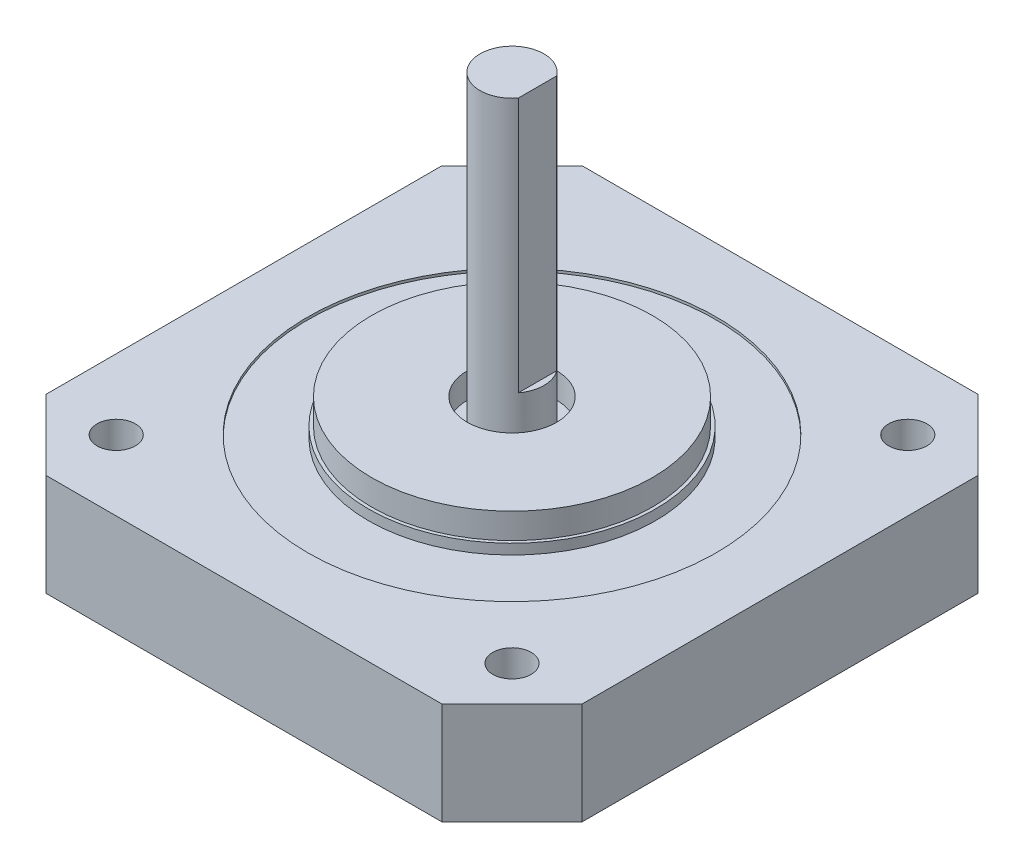
ISO-10303-21;
HEADER;
FILE_DESCRIPTION(('STEP AP214'),'2;1');
FILE_NAME('part.step','',(''),(''),'','','');
FILE_SCHEMA(('AUTOMOTIVE_DESIGN { 1 0 10303 214 1 1 1 1 }'));
ENDSEC;
DATA;
#1=APPLICATION_CONTEXT('core data for automotive mechanical design processes');
#2=APPLICATION_PROTOCOL_DEFINITION('international standard','automotive_design',2000,#1);
#3=PRODUCT_CONTEXT('',#1,'mechanical');
#4=PRODUCT('Part','Part','',(#3));
#5=PRODUCT_RELATED_PRODUCT_CATEGORY('part','',(#4));
#6=PRODUCT_DEFINITION_FORMATION('','',#4);
#7=PRODUCT_DEFINITION_CONTEXT('part definition',#1,'design');
#8=PRODUCT_DEFINITION('design','',#6,#7);
#9=PRODUCT_DEFINITION_SHAPE('','',#8);
#10=(LENGTH_UNIT() NAMED_UNIT(*) SI_UNIT(.MILLI.,.METRE.));
#11=(NAMED_UNIT(*) PLANE_ANGLE_UNIT() SI_UNIT($,.RADIAN.));
#12=(NAMED_UNIT(*) SI_UNIT($,.STERADIAN.) SOLID_ANGLE_UNIT());
#13=UNCERTAINTY_MEASURE_WITH_UNIT(LENGTH_MEASURE(1.E-05),#10,'distance_accuracy_value','');
#14=(GEOMETRIC_REPRESENTATION_CONTEXT(3) GLOBAL_UNCERTAINTY_ASSIGNED_CONTEXT((#13)) GLOBAL_UNIT_ASSIGNED_CONTEXT((#10,
#11,#12)) REPRESENTATION_CONTEXT('',''));
#15=CARTESIAN_POINT('',(0.,0.,0.));
#16=DIRECTION('',(0.,0.,1.));
#17=DIRECTION('',(1.,0.,0.));
#18=AXIS2_PLACEMENT_3D('',#15,#16,#17);
#19=CARTESIAN_POINT('',(21.,8.,-21.));
#20=DIRECTION('',(-1.,0.,0.));
#21=DIRECTION('',(0.,0.,1.));
#22=AXIS2_PLACEMENT_3D('',#19,#20,#21);
#23=PLANE('',#22);
#24=DIRECTION('',(0.,0.,-1.));
#25=VECTOR('',#24,1.);
#26=CARTESIAN_POINT('',(21.,0.,-21.));
#27=LINE('',#26,#25);
#28=CARTESIAN_POINT('',(21.,0.,15.5));
#29=VERTEX_POINT('',#28);
#30=CARTESIAN_POINT('',(21.,0.,-15.5));
#31=VERTEX_POINT('',#30);
#32=EDGE_CURVE('E179',#29,#31,#27,.T.);
#33=ORIENTED_EDGE('',*,*,#32,.T.);
#34=DIRECTION('',(0.,1.,0.));
#35=VECTOR('',#34,1.);
#36=CARTESIAN_POINT('',(21.,8.,-15.5));
#37=LINE('',#36,#35);
#38=CARTESIAN_POINT('',(21.,8.,-15.5));
#39=VERTEX_POINT('',#38);
#40=EDGE_CURVE('E232',#31,#39,#37,.T.);
#41=ORIENTED_EDGE('',*,*,#40,.T.);
#42=DIRECTION('',(0.,0.,-1.));
#43=VECTOR('',#42,1.);
#44=CARTESIAN_POINT('',(21.,8.,-21.));
#45=LINE('',#44,#43);
#46=CARTESIAN_POINT('',(21.,8.,15.5));
#47=VERTEX_POINT('',#46);
#48=EDGE_CURVE('E182',#47,#39,#45,.T.);
#49=ORIENTED_EDGE('',*,*,#48,.F.);
#50=DIRECTION('',(0.,-1.,0.));
#51=VECTOR('',#50,1.);
#52=CARTESIAN_POINT('',(21.,8.,15.5));
#53=LINE('',#52,#51);
#54=EDGE_CURVE('E229',#47,#29,#53,.T.);
#55=ORIENTED_EDGE('',*,*,#54,.T.);
#56=EDGE_LOOP('',(#33,#41,#49,#55));
#57=FACE_BOUND('',#56,.T.);
#58=ADVANCED_FACE('F33',(#57),#23,.F.);
#59=CARTESIAN_POINT('',(-21.,8.,-21.));
#60=DIRECTION('',(0.,0.,1.));
#61=DIRECTION('',(1.,0.,0.));
#62=AXIS2_PLACEMENT_3D('',#59,#60,#61);
#63=PLANE('',#62);
#64=DIRECTION('',(-1.,0.,0.));
#65=VECTOR('',#64,1.);
#66=CARTESIAN_POINT('',(-21.,0.,-21.));
#67=LINE('',#66,#65);
#68=CARTESIAN_POINT('',(15.5,0.,-21.));
#69=VERTEX_POINT('',#68);
#70=CARTESIAN_POINT('',(-15.5,0.,-21.));
#71=VERTEX_POINT('',#70);
#72=EDGE_CURVE('E197',#69,#71,#67,.T.);
#73=ORIENTED_EDGE('',*,*,#72,.T.);
#74=DIRECTION('',(0.,1.,0.));
#75=VECTOR('',#74,1.);
#76=CARTESIAN_POINT('',(-15.5,8.,-21.));
#77=LINE('',#76,#75);
#78=CARTESIAN_POINT('',(-15.5,8.,-21.));
#79=VERTEX_POINT('',#78);
#80=EDGE_CURVE('E219',#71,#79,#77,.T.);
#81=ORIENTED_EDGE('',*,*,#80,.T.);
#82=DIRECTION('',(-1.,0.,0.));
#83=VECTOR('',#82,1.);
#84=CARTESIAN_POINT('',(-21.,8.,-21.));
#85=LINE('',#84,#83);
#86=CARTESIAN_POINT('',(15.5,8.,-21.));
#87=VERTEX_POINT('',#86);
#88=EDGE_CURVE('E185',#87,#79,#85,.T.);
#89=ORIENTED_EDGE('',*,*,#88,.F.);
#90=DIRECTION('',(0.,-1.,0.));
#91=VECTOR('',#90,1.);
#92=CARTESIAN_POINT('',(15.5,8.,-21.));
#93=LINE('',#92,#91);
#94=EDGE_CURVE('E216',#87,#69,#93,.T.);
#95=ORIENTED_EDGE('',*,*,#94,.T.);
#96=EDGE_LOOP('',(#73,#81,#89,#95));
#97=FACE_BOUND('',#96,.T.);
#98=ADVANCED_FACE('F260',(#97),#63,.F.);
#99=CARTESIAN_POINT('',(-21.,8.,-21.));
#100=DIRECTION('',(1.,0.,0.));
#101=DIRECTION('',(0.,0.,-1.));
#102=AXIS2_PLACEMENT_3D('',#99,#100,#101);
#103=PLANE('',#102);
#104=DIRECTION('',(0.,0.,1.));
#105=VECTOR('',#104,1.);
#106=CARTESIAN_POINT('',(-21.,8.,-21.));
#107=LINE('',#106,#105);
#108=CARTESIAN_POINT('',(-21.,8.,-15.5));
#109=VERTEX_POINT('',#108);
#110=CARTESIAN_POINT('',(-21.,8.,15.5));
#111=VERTEX_POINT('',#110);
#112=EDGE_CURVE('E189',#109,#111,#107,.T.);
#113=ORIENTED_EDGE('',*,*,#112,.F.);
#114=DIRECTION('',(0.,-1.,0.));
#115=VECTOR('',#114,1.);
#116=CARTESIAN_POINT('',(-21.,8.,-15.5));
#117=LINE('',#116,#115);
#118=CARTESIAN_POINT('',(-21.,0.,-15.5));
#119=VERTEX_POINT('',#118);
#120=EDGE_CURVE('E205',#109,#119,#117,.T.);
#121=ORIENTED_EDGE('',*,*,#120,.T.);
#122=DIRECTION('',(0.,0.,1.));
#123=VECTOR('',#122,1.);
#124=CARTESIAN_POINT('',(-21.,0.,-21.));
#125=LINE('',#124,#123);
#126=CARTESIAN_POINT('',(-21.,0.,15.5));
#127=VERTEX_POINT('',#126);
#128=EDGE_CURVE('E200',#119,#127,#125,.T.);
#129=ORIENTED_EDGE('',*,*,#128,.T.);
#130=DIRECTION('',(0.,1.,0.));
#131=VECTOR('',#130,1.);
#132=CARTESIAN_POINT('',(-21.,8.,15.5));
#133=LINE('',#132,#131);
#134=EDGE_CURVE('E194',#127,#111,#133,.T.);
#135=ORIENTED_EDGE('',*,*,#134,.T.);
#136=EDGE_LOOP('',(#113,#121,#129,#135));
#137=FACE_BOUND('',#136,.T.);
#138=ADVANCED_FACE('F268',(#137),#103,.F.);
#139=CARTESIAN_POINT('',(-21.,8.,21.));
#140=DIRECTION('',(0.,0.,-1.));
#141=DIRECTION('',(-1.,0.,0.));
#142=AXIS2_PLACEMENT_3D('',#139,#140,#141);
#143=PLANE('',#142);
#144=DIRECTION('',(1.,0.,0.));
#145=VECTOR('',#144,1.);
#146=CARTESIAN_POINT('',(-21.,0.,21.));
#147=LINE('',#146,#145);
#148=CARTESIAN_POINT('',(-15.5,0.,21.));
#149=VERTEX_POINT('',#148);
#150=CARTESIAN_POINT('',(15.5,0.,21.));
#151=VERTEX_POINT('',#150);
#152=EDGE_CURVE('E186',#149,#151,#147,.T.);
#153=ORIENTED_EDGE('',*,*,#152,.T.);
#154=DIRECTION('',(0.,1.,0.));
#155=VECTOR('',#154,1.);
#156=CARTESIAN_POINT('',(15.5,8.,21.));
#157=LINE('',#156,#155);
#158=CARTESIAN_POINT('',(15.5,8.,21.));
#159=VERTEX_POINT('',#158);
#160=EDGE_CURVE('E37',#151,#159,#157,.T.);
#161=ORIENTED_EDGE('',*,*,#160,.T.);
#162=DIRECTION('',(1.,0.,0.));
#163=VECTOR('',#162,1.);
#164=CARTESIAN_POINT('',(-21.,8.,21.));
#165=LINE('',#164,#163);
#166=CARTESIAN_POINT('',(-15.5,8.,21.));
#167=VERTEX_POINT('',#166);
#168=EDGE_CURVE('E192',#167,#159,#165,.T.);
#169=ORIENTED_EDGE('',*,*,#168,.F.);
#170=DIRECTION('',(0.,-1.,0.));
#171=VECTOR('',#170,1.);
#172=CARTESIAN_POINT('',(-15.5,8.,21.));
#173=LINE('',#172,#171);
#174=EDGE_CURVE('E233',#167,#149,#173,.T.);
#175=ORIENTED_EDGE('',*,*,#174,.T.);
#176=EDGE_LOOP('',(#153,#161,#169,#175));
#177=FACE_BOUND('',#176,.T.);
#178=ADVANCED_FACE('F237',(#177),#143,.F.);
#179=CARTESIAN_POINT('',(0.,8.,0.));
#180=DIRECTION('',(0.,1.,0.));
#181=DIRECTION('',(0.,0.,1.));
#182=AXIS2_PLACEMENT_3D('',#179,#180,#181);
#183=PLANE('',#182);
#184=CARTESIAN_POINT('',(0.,8.,0.));
#185=DIRECTION('',(0.,1.,0.));
#186=DIRECTION('',(0.,0.,1.));
#187=AXIS2_PLACEMENT_3D('',#184,#185,#186);
#188=CIRCLE('',#187,16.);
#189=CARTESIAN_POINT('',(0.,8.,16.));
#190=VERTEX_POINT('',#189);
#191=EDGE_CURVE('E149',#190,#190,#188,.T.);
#192=ORIENTED_EDGE('',*,*,#191,.F.);
#193=EDGE_LOOP('',(#192));
#194=FACE_BOUND('',#193,.T.);
#195=CARTESIAN_POINT('',(15.5,8.,-15.5));
#196=DIRECTION('',(0.,-1.,0.));
#197=DIRECTION('',(0.,0.,1.));
#198=AXIS2_PLACEMENT_3D('',#195,#196,#197);
#199=CIRCLE('',#198,1.5);
#200=CARTESIAN_POINT('',(15.5,8.,-14.));
#201=VERTEX_POINT('',#200);
#202=EDGE_CURVE('E164',#201,#201,#199,.T.);
#203=ORIENTED_EDGE('',*,*,#202,.T.);
#204=EDGE_LOOP('',(#203));
#205=FACE_BOUND('',#204,.T.);
#206=CARTESIAN_POINT('',(-15.5,8.,15.5));
#207=DIRECTION('',(0.,-1.,0.));
#208=DIRECTION('',(0.,0.,1.));
#209=AXIS2_PLACEMENT_3D('',#206,#207,#208);
#210=CIRCLE('',#209,1.5);
#211=CARTESIAN_POINT('',(-15.5,8.,17.));
#212=VERTEX_POINT('',#211);
#213=EDGE_CURVE('E171',#212,#212,#210,.T.);
#214=ORIENTED_EDGE('',*,*,#213,.T.);
#215=EDGE_LOOP('',(#214));
#216=FACE_BOUND('',#215,.T.);
#217=CARTESIAN_POINT('',(15.5,8.,15.5));
#218=DIRECTION('',(0.,-1.,0.));
#219=DIRECTION('',(0.,0.,-1.));
#220=AXIS2_PLACEMENT_3D('',#217,#218,#219);
#221=CIRCLE('',#220,1.5);
#222=CARTESIAN_POINT('',(15.5,8.,14.));
#223=VERTEX_POINT('',#222);
#224=EDGE_CURVE('E158',#223,#223,#221,.T.);
#225=ORIENTED_EDGE('',*,*,#224,.T.);
#226=EDGE_LOOP('',(#225));
#227=FACE_BOUND('',#226,.T.);
#228=CARTESIAN_POINT('',(-15.5,8.,-15.5));
#229=DIRECTION('',(0.,-1.,0.));
#230=DIRECTION('',(0.,0.,-1.));
#231=AXIS2_PLACEMENT_3D('',#228,#229,#230);
#232=CIRCLE('',#231,1.5);
#233=CARTESIAN_POINT('',(-15.5,8.,-17.));
#234=VERTEX_POINT('',#233);
#235=EDGE_CURVE('E176',#234,#234,#232,.T.);
#236=ORIENTED_EDGE('',*,*,#235,.T.);
#237=EDGE_LOOP('',(#236));
#238=FACE_BOUND('',#237,.T.);
#239=ORIENTED_EDGE('',*,*,#88,.T.);
#240=DIRECTION('',(0.707106781186549,0.,-0.707106781186546));
#241=VECTOR('',#240,1.);
#242=CARTESIAN_POINT('',(-18.25,8.,-18.25));
#243=LINE('',#242,#241);
#244=EDGE_CURVE('E227',#79,#109,#243,.F.);
#245=ORIENTED_EDGE('',*,*,#244,.T.);
#246=ORIENTED_EDGE('',*,*,#112,.T.);
#247=DIRECTION('',(-0.707106781186546,0.,-0.707106781186549));
#248=VECTOR('',#247,1.);
#249=CARTESIAN_POINT('',(-18.25,8.,18.25));
#250=LINE('',#249,#248);
#251=EDGE_CURVE('E221',#111,#167,#250,.F.);
#252=ORIENTED_EDGE('',*,*,#251,.T.);
#253=ORIENTED_EDGE('',*,*,#168,.T.);
#254=DIRECTION('',(-0.707106781186549,0.,0.707106781186546));
#255=VECTOR('',#254,1.);
#256=CARTESIAN_POINT('',(18.25,8.,18.25));
#257=LINE('',#256,#255);
#258=EDGE_CURVE('E223',#159,#47,#257,.F.);
#259=ORIENTED_EDGE('',*,*,#258,.T.);
#260=ORIENTED_EDGE('',*,*,#48,.T.);
#261=DIRECTION('',(0.707106781186546,0.,0.707106781186549));
#262=VECTOR('',#261,1.);
#263=CARTESIAN_POINT('',(18.25,8.,-18.25));
#264=LINE('',#263,#262);
#265=EDGE_CURVE('E225',#39,#87,#264,.F.);
#266=ORIENTED_EDGE('',*,*,#265,.T.);
#267=EDGE_LOOP('',(#239,#245,#246,#252,#253,#259,#260,#266));
#268=FACE_BOUND('',#267,.T.);
#269=ADVANCED_FACE('F253',(#194,#205,#216,#227,#238,#268),#183,.T.);
#270=CARTESIAN_POINT('',(0.,0.,0.));
#271=DIRECTION('',(0.,1.,0.));
#272=DIRECTION('',(0.,0.,1.));
#273=AXIS2_PLACEMENT_3D('',#270,#271,#272);
#274=PLANE('',#273);
#275=CARTESIAN_POINT('',(15.5,0.,-15.5));
#276=DIRECTION('',(0.,-1.,0.));
#277=DIRECTION('',(0.,0.,1.));
#278=AXIS2_PLACEMENT_3D('',#275,#276,#277);
#279=CIRCLE('',#278,1.5);
#280=CARTESIAN_POINT('',(15.5,0.,-14.));
#281=VERTEX_POINT('',#280);
#282=EDGE_CURVE('E168',#281,#281,#279,.T.);
#283=ORIENTED_EDGE('',*,*,#282,.F.);
#284=EDGE_LOOP('',(#283));
#285=FACE_BOUND('',#284,.T.);
#286=CARTESIAN_POINT('',(-15.5,0.,15.5));
#287=DIRECTION('',(0.,-1.,0.));
#288=DIRECTION('',(0.,0.,1.));
#289=AXIS2_PLACEMENT_3D('',#286,#287,#288);
#290=CIRCLE('',#289,1.5);
#291=CARTESIAN_POINT('',(-15.5,0.,17.));
#292=VERTEX_POINT('',#291);
#293=EDGE_CURVE('E161',#292,#292,#290,.T.);
#294=ORIENTED_EDGE('',*,*,#293,.F.);
#295=EDGE_LOOP('',(#294));
#296=FACE_BOUND('',#295,.T.);
#297=CARTESIAN_POINT('',(15.5,0.,15.5));
#298=DIRECTION('',(0.,-1.,0.));
#299=DIRECTION('',(0.,0.,-1.));
#300=AXIS2_PLACEMENT_3D('',#297,#298,#299);
#301=CIRCLE('',#300,1.5);
#302=CARTESIAN_POINT('',(15.5,0.,14.));
#303=VERTEX_POINT('',#302);
#304=EDGE_CURVE('E155',#303,#303,#301,.T.);
#305=ORIENTED_EDGE('',*,*,#304,.F.);
#306=EDGE_LOOP('',(#305));
#307=FACE_BOUND('',#306,.T.);
#308=CARTESIAN_POINT('',(-15.5,0.,-15.5));
#309=DIRECTION('',(0.,-1.,0.));
#310=DIRECTION('',(0.,0.,-1.));
#311=AXIS2_PLACEMENT_3D('',#308,#309,#310);
#312=CIRCLE('',#311,1.5);
#313=CARTESIAN_POINT('',(-15.5,0.,-17.));
#314=VERTEX_POINT('',#313);
#315=EDGE_CURVE('E167',#314,#314,#312,.T.);
#316=ORIENTED_EDGE('',*,*,#315,.F.);
#317=EDGE_LOOP('',(#316));
#318=FACE_BOUND('',#317,.T.);
#319=ORIENTED_EDGE('',*,*,#128,.F.);
#320=DIRECTION('',(-0.707106781186549,0.,0.707106781186546));
#321=VECTOR('',#320,1.);
#322=CARTESIAN_POINT('',(-21.,0.,-15.5));
#323=LINE('',#322,#321);
#324=EDGE_CURVE('E214',#119,#71,#323,.F.);
#325=ORIENTED_EDGE('',*,*,#324,.T.);
#326=ORIENTED_EDGE('',*,*,#72,.F.);
#327=DIRECTION('',(-0.707106781186546,0.,-0.707106781186549));
#328=VECTOR('',#327,1.);
#329=CARTESIAN_POINT('',(15.5,0.,-21.));
#330=LINE('',#329,#328);
#331=EDGE_CURVE('E212',#69,#31,#330,.F.);
#332=ORIENTED_EDGE('',*,*,#331,.T.);
#333=ORIENTED_EDGE('',*,*,#32,.F.);
#334=DIRECTION('',(0.707106781186549,0.,-0.707106781186546));
#335=VECTOR('',#334,1.);
#336=CARTESIAN_POINT('',(21.,0.,15.5));
#337=LINE('',#336,#335);
#338=EDGE_CURVE('E210',#29,#151,#337,.F.);
#339=ORIENTED_EDGE('',*,*,#338,.T.);
#340=ORIENTED_EDGE('',*,*,#152,.F.);
#341=DIRECTION('',(0.707106781186546,0.,0.707106781186549));
#342=VECTOR('',#341,1.);
#343=CARTESIAN_POINT('',(-15.5,0.,21.));
#344=LINE('',#343,#342);
#345=EDGE_CURVE('E208',#149,#127,#344,.F.);
#346=ORIENTED_EDGE('',*,*,#345,.T.);
#347=EDGE_LOOP('',(#319,#325,#326,#332,#333,#339,#340,#346));
#348=FACE_BOUND('',#347,.T.);
#349=ADVANCED_FACE('F242',(#285,#296,#307,#318,#348),#274,.F.);
#350=CARTESIAN_POINT('',(-21.,8.,-15.5));
#351=DIRECTION('',(0.707106781186546,0.,0.707106781186549));
#352=DIRECTION('',(0.,-1.,0.));
#353=AXIS2_PLACEMENT_3D('',#350,#351,#352);
#354=PLANE('',#353);
#355=ORIENTED_EDGE('',*,*,#244,.F.);
#356=ORIENTED_EDGE('',*,*,#80,.F.);
#357=ORIENTED_EDGE('',*,*,#324,.F.);
#358=ORIENTED_EDGE('',*,*,#120,.F.);
#359=EDGE_LOOP('',(#355,#356,#357,#358));
#360=FACE_BOUND('',#359,.T.);
#361=ADVANCED_FACE('F265',(#360),#354,.F.);
#362=CARTESIAN_POINT('',(15.5,8.,-21.));
#363=DIRECTION('',(-0.707106781186549,0.,0.707106781186546));
#364=DIRECTION('',(0.,-1.,0.));
#365=AXIS2_PLACEMENT_3D('',#362,#363,#364);
#366=PLANE('',#365);
#367=ORIENTED_EDGE('',*,*,#265,.F.);
#368=ORIENTED_EDGE('',*,*,#40,.F.);
#369=ORIENTED_EDGE('',*,*,#331,.F.);
#370=ORIENTED_EDGE('',*,*,#94,.F.);
#371=EDGE_LOOP('',(#367,#368,#369,#370));
#372=FACE_BOUND('',#371,.T.);
#373=ADVANCED_FACE('F257',(#372),#366,.F.);
#374=CARTESIAN_POINT('',(21.,8.,15.5));
#375=DIRECTION('',(-0.707106781186546,0.,-0.707106781186549));
#376=DIRECTION('',(0.,-1.,0.));
#377=AXIS2_PLACEMENT_3D('',#374,#375,#376);
#378=PLANE('',#377);
#379=ORIENTED_EDGE('',*,*,#258,.F.);
#380=ORIENTED_EDGE('',*,*,#160,.F.);
#381=ORIENTED_EDGE('',*,*,#338,.F.);
#382=ORIENTED_EDGE('',*,*,#54,.F.);
#383=EDGE_LOOP('',(#379,#380,#381,#382));
#384=FACE_BOUND('',#383,.T.);
#385=ADVANCED_FACE('F247',(#384),#378,.F.);
#386=CARTESIAN_POINT('',(-15.5,8.,21.));
#387=DIRECTION('',(0.707106781186549,0.,-0.707106781186546));
#388=DIRECTION('',(0.,-1.,0.));
#389=AXIS2_PLACEMENT_3D('',#386,#387,#388);
#390=PLANE('',#389);
#391=ORIENTED_EDGE('',*,*,#251,.F.);
#392=ORIENTED_EDGE('',*,*,#134,.F.);
#393=ORIENTED_EDGE('',*,*,#345,.F.);
#394=ORIENTED_EDGE('',*,*,#174,.F.);
#395=EDGE_LOOP('',(#391,#392,#393,#394));
#396=FACE_BOUND('',#395,.T.);
#397=ADVANCED_FACE('F35',(#396),#390,.F.);
#398=CARTESIAN_POINT('',(-15.5,8.,-15.5));
#399=DIRECTION('',(0.,-1.,0.));
#400=DIRECTION('',(0.,0.,-1.));
#401=AXIS2_PLACEMENT_3D('',#398,#399,#400);
#402=CYLINDRICAL_SURFACE('',#401,1.5);
#403=ORIENTED_EDGE('',*,*,#235,.F.);
#404=EDGE_LOOP('',(#403));
#405=FACE_BOUND('',#404,.T.);
#406=ORIENTED_EDGE('',*,*,#315,.T.);
#407=EDGE_LOOP('',(#406));
#408=FACE_BOUND('',#407,.T.);
#409=ADVANCED_FACE('F271',(#405,#408),#402,.F.);
#410=CARTESIAN_POINT('',(15.5,8.,15.5));
#411=DIRECTION('',(0.,-1.,0.));
#412=DIRECTION('',(0.,0.,-1.));
#413=AXIS2_PLACEMENT_3D('',#410,#411,#412);
#414=CYLINDRICAL_SURFACE('',#413,1.5);
#415=ORIENTED_EDGE('',*,*,#224,.F.);
#416=EDGE_LOOP('',(#415));
#417=FACE_BOUND('',#416,.T.);
#418=ORIENTED_EDGE('',*,*,#304,.T.);
#419=EDGE_LOOP('',(#418));
#420=FACE_BOUND('',#419,.T.);
#421=ADVANCED_FACE('F276',(#417,#420),#414,.F.);
#422=CARTESIAN_POINT('',(-15.5,8.,15.5));
#423=DIRECTION('',(0.,-1.,0.));
#424=DIRECTION('',(0.,0.,-1.));
#425=AXIS2_PLACEMENT_3D('',#422,#423,#424);
#426=CYLINDRICAL_SURFACE('',#425,1.5);
#427=ORIENTED_EDGE('',*,*,#213,.F.);
#428=EDGE_LOOP('',(#427));
#429=FACE_BOUND('',#428,.T.);
#430=ORIENTED_EDGE('',*,*,#293,.T.);
#431=EDGE_LOOP('',(#430));
#432=FACE_BOUND('',#431,.T.);
#433=ADVANCED_FACE('F329',(#429,#432),#426,.F.);
#434=CARTESIAN_POINT('',(15.5,8.,-15.5));
#435=DIRECTION('',(0.,-1.,0.));
#436=DIRECTION('',(0.,0.,-1.));
#437=AXIS2_PLACEMENT_3D('',#434,#435,#436);
#438=CYLINDRICAL_SURFACE('',#437,1.5);
#439=ORIENTED_EDGE('',*,*,#202,.F.);
#440=EDGE_LOOP('',(#439));
#441=FACE_BOUND('',#440,.T.);
#442=ORIENTED_EDGE('',*,*,#282,.T.);
#443=EDGE_LOOP('',(#442));
#444=FACE_BOUND('',#443,.T.);
#445=ADVANCED_FACE('F339',(#441,#444),#438,.F.);
#446=CARTESIAN_POINT('',(0.,7.8,0.));
#447=DIRECTION('',(0.,1.,0.));
#448=DIRECTION('',(0.,0.,1.));
#449=AXIS2_PLACEMENT_3D('',#446,#447,#448);
#450=CYLINDRICAL_SURFACE('',#449,16.);
#451=CARTESIAN_POINT('',(0.,7.8,0.));
#452=DIRECTION('',(0.,1.,0.));
#453=DIRECTION('',(0.,0.,1.));
#454=AXIS2_PLACEMENT_3D('',#451,#452,#453);
#455=CIRCLE('',#454,16.);
#456=CARTESIAN_POINT('',(0.,7.8,16.));
#457=VERTEX_POINT('',#456);
#458=EDGE_CURVE('E152',#457,#457,#455,.T.);
#459=ORIENTED_EDGE('',*,*,#458,.F.);
#460=EDGE_LOOP('',(#459));
#461=FACE_BOUND('',#460,.T.);
#462=ORIENTED_EDGE('',*,*,#191,.T.);
#463=EDGE_LOOP('',(#462));
#464=FACE_BOUND('',#463,.T.);
#465=ADVANCED_FACE('F349',(#461,#464),#450,.F.);
#466=CARTESIAN_POINT('',(0.,7.8,0.));
#467=DIRECTION('',(0.,1.,0.));
#468=DIRECTION('',(0.,0.,1.));
#469=AXIS2_PLACEMENT_3D('',#466,#467,#468);
#470=PLANE('',#469);
#471=CARTESIAN_POINT('',(0.,7.8,0.));
#472=DIRECTION('',(0.,1.,0.));
#473=DIRECTION('',(0.,0.,1.));
#474=AXIS2_PLACEMENT_3D('',#471,#472,#473);
#475=CIRCLE('',#474,11.25);
#476=CARTESIAN_POINT('',(0.,7.8,11.25));
#477=VERTEX_POINT('',#476);
#478=EDGE_CURVE('E144',#477,#477,#475,.T.);
#479=ORIENTED_EDGE('',*,*,#478,.F.);
#480=EDGE_LOOP('',(#479));
#481=FACE_BOUND('',#480,.T.);
#482=ORIENTED_EDGE('',*,*,#458,.T.);
#483=EDGE_LOOP('',(#482));
#484=FACE_BOUND('',#483,.T.);
#485=ADVANCED_FACE('F368',(#481,#484),#470,.T.);
#486=CARTESIAN_POINT('',(0.,8.6,0.));
#487=DIRECTION('',(0.,-1.,0.));
#488=DIRECTION('',(0.,0.,-1.));
#489=AXIS2_PLACEMENT_3D('',#486,#487,#488);
#490=CYLINDRICAL_SURFACE('',#489,11.25);
#491=CARTESIAN_POINT('',(0.,8.6,0.));
#492=DIRECTION('',(0.,1.,0.));
#493=DIRECTION('',(0.,0.,1.));
#494=AXIS2_PLACEMENT_3D('',#491,#492,#493);
#495=CIRCLE('',#494,11.25);
#496=CARTESIAN_POINT('',(0.,8.6,11.25));
#497=VERTEX_POINT('',#496);
#498=EDGE_CURVE('E146',#497,#497,#495,.T.);
#499=ORIENTED_EDGE('',*,*,#498,.F.);
#500=EDGE_LOOP('',(#499));
#501=FACE_BOUND('',#500,.T.);
#502=ORIENTED_EDGE('',*,*,#478,.T.);
#503=EDGE_LOOP('',(#502));
#504=FACE_BOUND('',#503,.T.);
#505=ADVANCED_FACE('F378',(#501,#504),#490,.T.);
#506=CARTESIAN_POINT('',(0.,8.6,0.));
#507=DIRECTION('',(0.,1.,0.));
#508=DIRECTION('',(0.,0.,1.));
#509=AXIS2_PLACEMENT_3D('',#506,#507,#508);
#510=PLANE('',#509);
#511=CARTESIAN_POINT('',(0.,8.6,0.));
#512=DIRECTION('',(0.,1.,0.));
#513=DIRECTION('',(0.,0.,1.));
#514=AXIS2_PLACEMENT_3D('',#511,#512,#513);
#515=CIRCLE('',#514,11.);
#516=CARTESIAN_POINT('',(0.,8.6,11.));
#517=VERTEX_POINT('',#516);
#518=EDGE_CURVE('E11',#517,#517,#515,.T.);
#519=ORIENTED_EDGE('',*,*,#518,.F.);
#520=EDGE_LOOP('',(#519));
#521=FACE_BOUND('',#520,.T.);
#522=ORIENTED_EDGE('',*,*,#498,.T.);
#523=EDGE_LOOP('',(#522));
#524=FACE_BOUND('',#523,.T.);
#525=ADVANCED_FACE('F388',(#521,#524),#510,.T.);
#526=CARTESIAN_POINT('',(0.,10.6,0.));
#527=DIRECTION('',(0.,-1.,0.));
#528=DIRECTION('',(0.,0.,-1.));
#529=AXIS2_PLACEMENT_3D('',#526,#527,#528);
#530=CYLINDRICAL_SURFACE('',#529,11.);
#531=CARTESIAN_POINT('',(0.,10.6,0.));
#532=DIRECTION('',(0.,1.,0.));
#533=DIRECTION('',(0.,0.,1.));
#534=AXIS2_PLACEMENT_3D('',#531,#532,#533);
#535=CIRCLE('',#534,11.);
#536=CARTESIAN_POINT('',(0.,10.6,11.));
#537=VERTEX_POINT('',#536);
#538=EDGE_CURVE('E140',#537,#537,#535,.T.);
#539=ORIENTED_EDGE('',*,*,#538,.F.);
#540=EDGE_LOOP('',(#539));
#541=FACE_BOUND('',#540,.T.);
#542=ORIENTED_EDGE('',*,*,#518,.T.);
#543=EDGE_LOOP('',(#542));
#544=FACE_BOUND('',#543,.T.);
#545=ADVANCED_FACE('F398',(#541,#544),#530,.T.);
#546=CARTESIAN_POINT('',(0.,10.6,0.));
#547=DIRECTION('',(0.,1.,0.));
#548=DIRECTION('',(0.,0.,1.));
#549=AXIS2_PLACEMENT_3D('',#546,#547,#548);
#550=PLANE('',#549);
#551=CARTESIAN_POINT('',(0.,10.6,0.));
#552=DIRECTION('',(0.,1.,0.));
#553=DIRECTION('',(0.,0.,1.));
#554=AXIS2_PLACEMENT_3D('',#551,#552,#553);
#555=CIRCLE('',#554,3.5);
#556=CARTESIAN_POINT('',(0.,10.6,3.5));
#557=VERTEX_POINT('',#556);
#558=EDGE_CURVE('E137',#557,#557,#555,.T.);
#559=ORIENTED_EDGE('',*,*,#558,.F.);
#560=EDGE_LOOP('',(#559));
#561=FACE_BOUND('',#560,.T.);
#562=ORIENTED_EDGE('',*,*,#538,.T.);
#563=EDGE_LOOP('',(#562));
#564=FACE_BOUND('',#563,.T.);
#565=ADVANCED_FACE('F408',(#561,#564),#550,.T.);
#566=CARTESIAN_POINT('',(0.,10.6,0.));
#567=DIRECTION('',(0.,-1.,0.));
#568=DIRECTION('',(0.,0.,-1.));
#569=AXIS2_PLACEMENT_3D('',#566,#567,#568);
#570=CYLINDRICAL_SURFACE('',#569,3.5);
#571=ORIENTED_EDGE('',*,*,#558,.T.);
#572=EDGE_LOOP('',(#571));
#573=FACE_BOUND('',#572,.T.);
#574=CARTESIAN_POINT('',(0.,8.6,0.));
#575=DIRECTION('',(0.,1.,0.));
#576=DIRECTION('',(0.,0.,1.));
#577=AXIS2_PLACEMENT_3D('',#574,#575,#576);
#578=CIRCLE('',#577,3.5);
#579=CARTESIAN_POINT('',(0.,8.6,3.5));
#580=VERTEX_POINT('',#579);
#581=EDGE_CURVE('E134',#580,#580,#578,.T.);
#582=ORIENTED_EDGE('',*,*,#581,.F.);
#583=EDGE_LOOP('',(#582));
#584=FACE_BOUND('',#583,.T.);
#585=ADVANCED_FACE('F418',(#573,#584),#570,.F.);
#586=CARTESIAN_POINT('',(0.,8.6,0.));
#587=DIRECTION('',(0.,1.,0.));
#588=DIRECTION('',(0.,0.,1.));
#589=AXIS2_PLACEMENT_3D('',#586,#587,#588);
#590=PLANE('',#589);
#591=CARTESIAN_POINT('',(0.,8.6,0.));
#592=DIRECTION('',(0.,1.,0.));
#593=DIRECTION('',(0.,0.,1.));
#594=AXIS2_PLACEMENT_3D('',#591,#592,#593);
#595=CIRCLE('',#594,2.5);
#596=CARTESIAN_POINT('',(0.,8.6,2.5));
#597=VERTEX_POINT('',#596);
#598=EDGE_CURVE('E129',#597,#597,#595,.T.);
#599=ORIENTED_EDGE('',*,*,#598,.F.);
#600=EDGE_LOOP('',(#599));
#601=FACE_BOUND('',#600,.T.);
#602=ORIENTED_EDGE('',*,*,#581,.T.);
#603=EDGE_LOOP('',(#602));
#604=FACE_BOUND('',#603,.T.);
#605=ADVANCED_FACE('F428',(#601,#604),#590,.T.);
#606=CARTESIAN_POINT('',(0.,32.6,0.));
#607=DIRECTION('',(0.,-1.,0.));
#608=DIRECTION('',(0.,0.,-1.));
#609=AXIS2_PLACEMENT_3D('',#606,#607,#608);
#610=CYLINDRICAL_SURFACE('',#609,2.5);
#611=CARTESIAN_POINT('',(0.,32.6,0.));
#612=DIRECTION('',(0.,1.,0.));
#613=DIRECTION('',(0.,0.,1.));
#614=AXIS2_PLACEMENT_3D('',#611,#612,#613);
#615=CIRCLE('',#614,2.5);
#616=CARTESIAN_POINT('',(2.,32.6,-1.5));
#617=VERTEX_POINT('',#616);
#618=CARTESIAN_POINT('',(2.,32.6,1.5));
#619=VERTEX_POINT('',#618);
#620=EDGE_CURVE('E127',#617,#619,#615,.T.);
#621=ORIENTED_EDGE('',*,*,#620,.F.);
#622=DIRECTION('',(0.,1.,0.));
#623=VECTOR('',#622,1.);
#624=CARTESIAN_POINT('',(2.,12.6,-1.5));
#625=LINE('',#624,#623);
#626=CARTESIAN_POINT('',(2.,12.6,-1.5));
#627=VERTEX_POINT('',#626);
#628=EDGE_CURVE('E49',#627,#617,#625,.T.);
#629=ORIENTED_EDGE('',*,*,#628,.F.);
#630=CARTESIAN_POINT('',(0.,12.6,0.));
#631=DIRECTION('',(0.,1.,0.));
#632=DIRECTION('',(0.,0.,-1.));
#633=AXIS2_PLACEMENT_3D('',#630,#631,#632);
#634=CIRCLE('',#633,2.50000000000001);
#635=CARTESIAN_POINT('',(2.,12.6,1.5));
#636=VERTEX_POINT('',#635);
#637=EDGE_CURVE('E113',#636,#627,#634,.T.);
#638=ORIENTED_EDGE('',*,*,#637,.F.);
#639=DIRECTION('',(0.,1.,0.));
#640=VECTOR('',#639,1.);
#641=CARTESIAN_POINT('',(2.,12.6,1.5));
#642=LINE('',#641,#640);
#643=EDGE_CURVE('E121',#636,#619,#642,.T.);
#644=ORIENTED_EDGE('',*,*,#643,.T.);
#645=EDGE_LOOP('',(#621,#629,#638,#644));
#646=FACE_BOUND('',#645,.T.);
#647=ORIENTED_EDGE('',*,*,#598,.T.);
#648=EDGE_LOOP('',(#647));
#649=FACE_BOUND('',#648,.T.);
#650=ADVANCED_FACE('F124',(#646,#649),#610,.T.);
#651=CARTESIAN_POINT('',(0.,32.6,0.));
#652=DIRECTION('',(0.,1.,0.));
#653=DIRECTION('',(0.,0.,1.));
#654=AXIS2_PLACEMENT_3D('',#651,#652,#653);
#655=PLANE('',#654);
#656=DIRECTION('',(0.,0.,1.));
#657=VECTOR('',#656,1.);
#658=CARTESIAN_POINT('',(2.,32.6,-1.5));
#659=LINE('',#658,#657);
#660=EDGE_CURVE('E118',#617,#619,#659,.T.);
#661=ORIENTED_EDGE('',*,*,#660,.F.);
#662=ORIENTED_EDGE('',*,*,#620,.T.);
#663=EDGE_LOOP('',(#661,#662));
#664=FACE_BOUND('',#663,.T.);
#665=ADVANCED_FACE('F447',(#664),#655,.T.);
#666=CARTESIAN_POINT('',(2.,12.6,-1.5));
#667=DIRECTION('',(-1.,0.,0.));
#668=DIRECTION('',(0.,0.,1.));
#669=AXIS2_PLACEMENT_3D('',#666,#667,#668);
#670=PLANE('',#669);
#671=ORIENTED_EDGE('',*,*,#660,.T.);
#672=ORIENTED_EDGE('',*,*,#643,.F.);
#673=DIRECTION('',(0.,0.,1.));
#674=VECTOR('',#673,1.);
#675=CARTESIAN_POINT('',(2.,12.6,-1.5));
#676=LINE('',#675,#674);
#677=EDGE_CURVE('E115',#627,#636,#676,.T.);
#678=ORIENTED_EDGE('',*,*,#677,.F.);
#679=ORIENTED_EDGE('',*,*,#628,.T.);
#680=EDGE_LOOP('',(#671,#672,#678,#679));
#681=FACE_BOUND('',#680,.T.);
#682=ADVANCED_FACE('F120',(#681),#670,.F.);
#683=CARTESIAN_POINT('',(0.,12.6,0.));
#684=DIRECTION('',(0.,-1.,0.));
#685=DIRECTION('',(0.,0.,-1.));
#686=AXIS2_PLACEMENT_3D('',#683,#684,#685);
#687=PLANE('',#686);
#688=ORIENTED_EDGE('',*,*,#637,.T.);
#689=ORIENTED_EDGE('',*,*,#677,.T.);
#690=EDGE_LOOP('',(#688,#689));
#691=FACE_BOUND('',#690,.T.);
#692=ADVANCED_FACE('F114',(#691),#687,.F.);
#693=CLOSED_SHELL('',(#58,#98,#138,#178,#269,#349,#361,#373,#385,#397,#409,#421,#433,#445,#465,
#485,#505,#525,#545,#565,#585,#605,#650,#665,#682,#692));
#694=MANIFOLD_SOLID_BREP('B2',#693);
#695=ADVANCED_BREP_SHAPE_REPRESENTATION('',(#18,#694),#14);
#696=SHAPE_DEFINITION_REPRESENTATION(#9,#695);
ENDSEC;
END-ISO-10303-21;
